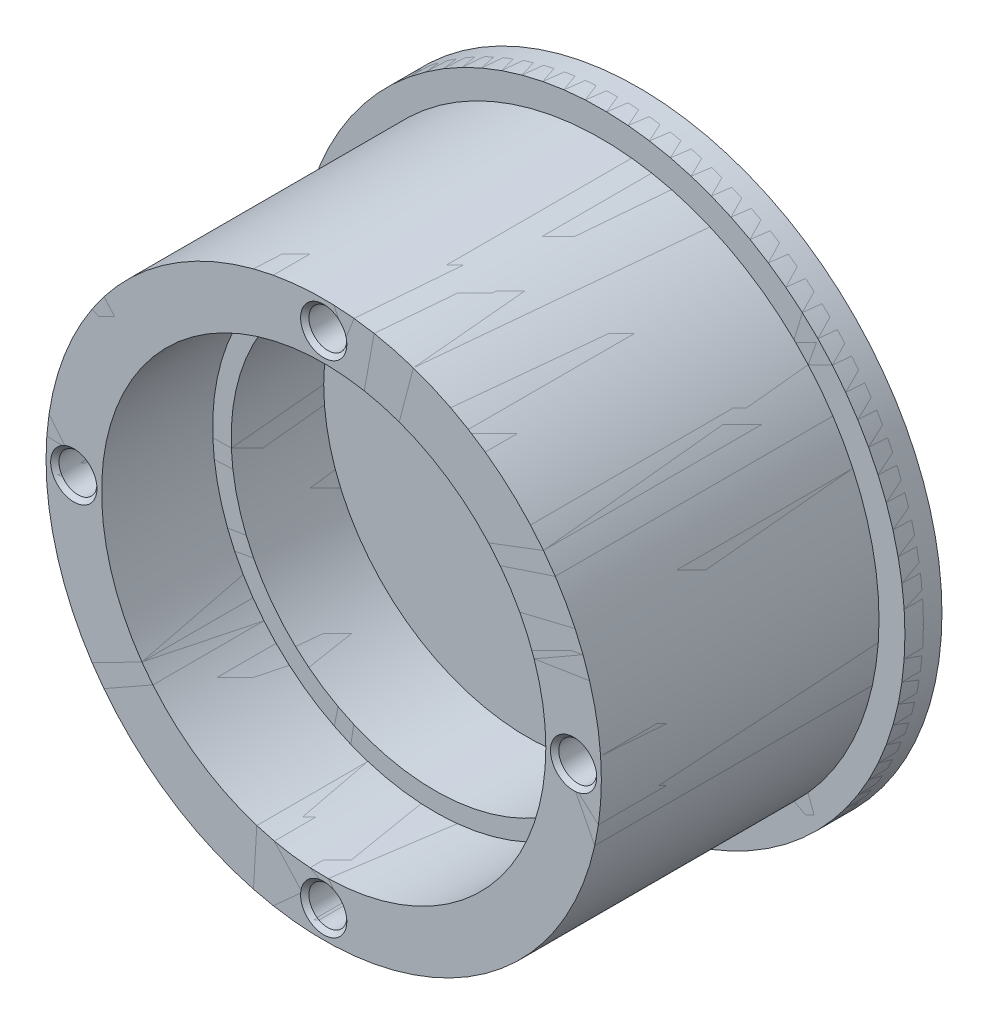
ISO-10303-21;
HEADER;
FILE_DESCRIPTION(('STEP AP214'),'2;1');
FILE_NAME('part.step','',(''),(''),'','','');
FILE_SCHEMA(('AUTOMOTIVE_DESIGN { 1 0 10303 214 1 1 1 1 }'));
ENDSEC;
DATA;
#1=APPLICATION_CONTEXT('core data for automotive mechanical design processes');
#2=APPLICATION_PROTOCOL_DEFINITION('international standard','automotive_design',2000,#1);
#3=PRODUCT_CONTEXT('',#1,'mechanical');
#4=PRODUCT('Part','Part','',(#3));
#5=PRODUCT_RELATED_PRODUCT_CATEGORY('part','',(#4));
#6=PRODUCT_DEFINITION_FORMATION('','',#4);
#7=PRODUCT_DEFINITION_CONTEXT('part definition',#1,'design');
#8=PRODUCT_DEFINITION('design','',#6,#7);
#9=PRODUCT_DEFINITION_SHAPE('','',#8);
#10=(LENGTH_UNIT() NAMED_UNIT(*) SI_UNIT(.MILLI.,.METRE.));
#11=(NAMED_UNIT(*) PLANE_ANGLE_UNIT() SI_UNIT($,.RADIAN.));
#12=(NAMED_UNIT(*) SI_UNIT($,.STERADIAN.) SOLID_ANGLE_UNIT());
#13=UNCERTAINTY_MEASURE_WITH_UNIT(LENGTH_MEASURE(1.E-05),#10,'distance_accuracy_value','');
#14=(GEOMETRIC_REPRESENTATION_CONTEXT(3) GLOBAL_UNCERTAINTY_ASSIGNED_CONTEXT((#13)) GLOBAL_UNIT_ASSIGNED_CONTEXT((#10,
#11,#12)) REPRESENTATION_CONTEXT('',''));
#15=CARTESIAN_POINT('',(0.,0.,0.));
#16=DIRECTION('',(0.,0.,1.));
#17=DIRECTION('',(1.,0.,0.));
#18=AXIS2_PLACEMENT_3D('',#15,#16,#17);
#19=CARTESIAN_POINT('',(0.,0.,-8.5));
#20=DIRECTION('',(0.,0.,1.));
#21=DIRECTION('',(1.,0.,0.));
#22=AXIS2_PLACEMENT_3D('',#19,#20,#21);
#23=CYLINDRICAL_SURFACE('',#22,16.4);
#24=CARTESIAN_POINT('',(0.,0.,-6.5));
#25=DIRECTION('',(0.,0.,-1.));
#26=DIRECTION('',(1.,0.,0.));
#27=AXIS2_PLACEMENT_3D('',#24,#25,#26);
#28=CIRCLE('',#27,16.4);
#29=CARTESIAN_POINT('',(16.4,0.,-6.5));
#30=VERTEX_POINT('',#29);
#31=EDGE_CURVE('P0_E151',#30,#30,#28,.T.);
#32=ORIENTED_EDGE('',*,*,#31,.T.);
#33=EDGE_LOOP('',(#32));
#34=FACE_BOUND('',#33,.T.);
#35=CARTESIAN_POINT('',(0.,0.,-7.5));
#36=DIRECTION('',(0.,0.,-1.));
#37=DIRECTION('',(-1.,0.,0.));
#38=AXIS2_PLACEMENT_3D('',#35,#36,#37);
#39=CIRCLE('',#38,16.4);
#40=CARTESIAN_POINT('',(-16.4,0.,-7.5));
#41=VERTEX_POINT('',#40);
#42=EDGE_CURVE('P0_E181',#41,#41,#39,.T.);
#43=ORIENTED_EDGE('',*,*,#42,.F.);
#44=EDGE_LOOP('',(#43));
#45=FACE_BOUND('',#44,.T.);
#46=ADVANCED_FACE('P0_F47',(#34,#45),#23,.T.);
#47=CARTESIAN_POINT('',(0.,13.5,8.5));
#48=DIRECTION('',(0.,0.,1.));
#49=DIRECTION('',(1.,0.,0.));
#50=AXIS2_PLACEMENT_3D('',#47,#48,#49);
#51=CONICAL_SURFACE('',#50,1.25,0.785398162500002);
#52=CARTESIAN_POINT('',(0.,13.5,8.5));
#53=DIRECTION('',(0.,0.,-1.));
#54=DIRECTION('',(1.,0.,0.));
#55=AXIS2_PLACEMENT_3D('',#52,#53,#54);
#56=CIRCLE('',#55,1.25);
#57=CARTESIAN_POINT('',(1.25000000000005,13.5,8.5));
#58=VERTEX_POINT('',#57);
#59=EDGE_CURVE('P0_E51',#58,#58,#56,.T.);
#60=ORIENTED_EDGE('',*,*,#59,.F.);
#61=EDGE_LOOP('',(#60));
#62=FACE_BOUND('',#61,.T.);
#63=CARTESIAN_POINT('',(0.,13.5,8.275));
#64=DIRECTION('',(0.,0.,1.));
#65=DIRECTION('',(1.,0.,0.));
#66=AXIS2_PLACEMENT_3D('',#63,#64,#65);
#67=CIRCLE('',#66,1.025);
#68=CARTESIAN_POINT('',(1.02500000000005,13.5,8.275));
#69=VERTEX_POINT('',#68);
#70=EDGE_CURVE('P0_E58',#69,#69,#67,.T.);
#71=ORIENTED_EDGE('',*,*,#70,.F.);
#72=EDGE_LOOP('',(#71));
#73=FACE_BOUND('',#72,.T.);
#74=ADVANCED_FACE('P0_F222',(#62,#73),#51,.F.);
#75=CARTESIAN_POINT('',(0.,13.5,8.5));
#76=DIRECTION('',(0.,0.,-1.));
#77=DIRECTION('',(-1.,0.,0.));
#78=AXIS2_PLACEMENT_3D('',#75,#76,#77);
#79=CYLINDRICAL_SURFACE('',#78,1.025);
#80=CARTESIAN_POINT('',(0.,13.5,3.5));
#81=DIRECTION('',(0.,0.,1.));
#82=DIRECTION('',(-1.,0.,0.));
#83=AXIS2_PLACEMENT_3D('',#80,#81,#82);
#84=CIRCLE('',#83,1.025);
#85=CARTESIAN_POINT('',(-1.02499999999995,13.5,3.5));
#86=VERTEX_POINT('',#85);
#87=EDGE_CURVE('P0_E140',#86,#86,#84,.T.);
#88=ORIENTED_EDGE('',*,*,#87,.F.);
#89=EDGE_LOOP('',(#88));
#90=FACE_BOUND('',#89,.T.);
#91=ORIENTED_EDGE('',*,*,#70,.T.);
#92=EDGE_LOOP('',(#91));
#93=FACE_BOUND('',#92,.T.);
#94=ADVANCED_FACE('P0_F227',(#90,#93),#79,.F.);
#95=CARTESIAN_POINT('',(0.,13.5,3.5));
#96=DIRECTION('',(0.,0.,1.));
#97=DIRECTION('',(1.,0.,0.));
#98=AXIS2_PLACEMENT_3D('',#95,#96,#97);
#99=CONICAL_SURFACE('',#98,1.025,1.0297442575);
#100=CARTESIAN_POINT('',(0.,13.5,2.88411786549675));
#101=VERTEX_POINT('',#100);
#102=VERTEX_LOOP('',#101);
#103=FACE_BOUND('',#102,.T.);
#104=ORIENTED_EDGE('',*,*,#87,.T.);
#105=EDGE_LOOP('',(#104));
#106=FACE_BOUND('',#105,.T.);
#107=ADVANCED_FACE('P0_F347',(#103,#106),#99,.F.);
#108=CARTESIAN_POINT('',(13.5,0.,8.5));
#109=DIRECTION('',(0.,0.,1.));
#110=DIRECTION('',(1.,0.,0.));
#111=AXIS2_PLACEMENT_3D('',#108,#109,#110);
#112=CONICAL_SURFACE('',#111,1.25,0.7853981625);
#113=CARTESIAN_POINT('',(13.5,0.,8.5));
#114=DIRECTION('',(0.,0.,-1.));
#115=DIRECTION('',(1.,0.,0.));
#116=AXIS2_PLACEMENT_3D('',#113,#114,#115);
#117=CIRCLE('',#116,1.25);
#118=CARTESIAN_POINT('',(14.75,0.,8.5));
#119=VERTEX_POINT('',#118);
#120=EDGE_CURVE('P0_E190',#119,#119,#117,.T.);
#121=ORIENTED_EDGE('',*,*,#120,.F.);
#122=EDGE_LOOP('',(#121));
#123=FACE_BOUND('',#122,.T.);
#124=CARTESIAN_POINT('',(13.5,0.,8.275));
#125=DIRECTION('',(0.,0.,1.));
#126=DIRECTION('',(1.,0.,0.));
#127=AXIS2_PLACEMENT_3D('',#124,#125,#126);
#128=CIRCLE('',#127,1.025);
#129=CARTESIAN_POINT('',(14.525,0.,8.275));
#130=VERTEX_POINT('',#129);
#131=EDGE_CURVE('P0_E136',#130,#130,#128,.T.);
#132=ORIENTED_EDGE('',*,*,#131,.F.);
#133=EDGE_LOOP('',(#132));
#134=FACE_BOUND('',#133,.T.);
#135=ADVANCED_FACE('P0_F343',(#123,#134),#112,.F.);
#136=CARTESIAN_POINT('',(13.5,0.,8.5));
#137=DIRECTION('',(0.,0.,-1.));
#138=DIRECTION('',(-1.,0.,0.));
#139=AXIS2_PLACEMENT_3D('',#136,#137,#138);
#140=CYLINDRICAL_SURFACE('',#139,1.025);
#141=CARTESIAN_POINT('',(13.5,0.,3.5));
#142=DIRECTION('',(0.,0.,1.));
#143=DIRECTION('',(-1.,0.,0.));
#144=AXIS2_PLACEMENT_3D('',#141,#142,#143);
#145=CIRCLE('',#144,1.025);
#146=CARTESIAN_POINT('',(12.475,0.,3.5));
#147=VERTEX_POINT('',#146);
#148=EDGE_CURVE('P0_E141',#147,#147,#145,.T.);
#149=ORIENTED_EDGE('',*,*,#148,.F.);
#150=EDGE_LOOP('',(#149));
#151=FACE_BOUND('',#150,.T.);
#152=ORIENTED_EDGE('',*,*,#131,.T.);
#153=EDGE_LOOP('',(#152));
#154=FACE_BOUND('',#153,.T.);
#155=ADVANCED_FACE('P0_F137',(#151,#154),#140,.F.);
#156=CARTESIAN_POINT('',(13.5,0.,3.5));
#157=DIRECTION('',(0.,0.,1.));
#158=DIRECTION('',(1.,0.,0.));
#159=AXIS2_PLACEMENT_3D('',#156,#157,#158);
#160=CONICAL_SURFACE('',#159,1.025,1.0297442575);
#161=CARTESIAN_POINT('',(13.5,0.,2.88411786549675));
#162=VERTEX_POINT('',#161);
#163=VERTEX_LOOP('',#162);
#164=FACE_BOUND('',#163,.T.);
#165=ORIENTED_EDGE('',*,*,#148,.T.);
#166=EDGE_LOOP('',(#165));
#167=FACE_BOUND('',#166,.T.);
#168=ADVANCED_FACE('P0_F49',(#164,#167),#160,.F.);
#169=CARTESIAN_POINT('',(0.,-13.5,8.5));
#170=DIRECTION('',(0.,0.,1.));
#171=DIRECTION('',(1.,0.,0.));
#172=AXIS2_PLACEMENT_3D('',#169,#170,#171);
#173=CONICAL_SURFACE('',#172,1.25,0.785398162500002);
#174=CARTESIAN_POINT('',(0.,-13.5,8.5));
#175=DIRECTION('',(0.,0.,-1.));
#176=DIRECTION('',(1.,0.,0.));
#177=AXIS2_PLACEMENT_3D('',#174,#175,#176);
#178=CIRCLE('',#177,1.25);
#179=CARTESIAN_POINT('',(1.24999999999998,-13.5,8.5));
#180=VERTEX_POINT('',#179);
#181=EDGE_CURVE('P0_E169',#180,#180,#178,.T.);
#182=ORIENTED_EDGE('',*,*,#181,.F.);
#183=EDGE_LOOP('',(#182));
#184=FACE_BOUND('',#183,.T.);
#185=CARTESIAN_POINT('',(0.,-13.5,8.275));
#186=DIRECTION('',(0.,0.,1.));
#187=DIRECTION('',(1.,0.,0.));
#188=AXIS2_PLACEMENT_3D('',#185,#186,#187);
#189=CIRCLE('',#188,1.025);
#190=CARTESIAN_POINT('',(1.02499999999998,-13.5,8.275));
#191=VERTEX_POINT('',#190);
#192=EDGE_CURVE('P0_E147',#191,#191,#189,.T.);
#193=ORIENTED_EDGE('',*,*,#192,.F.);
#194=EDGE_LOOP('',(#193));
#195=FACE_BOUND('',#194,.T.);
#196=ADVANCED_FACE('P0_F248',(#184,#195),#173,.F.);
#197=CARTESIAN_POINT('',(0.,-13.5,8.5));
#198=DIRECTION('',(0.,0.,-1.));
#199=DIRECTION('',(-1.,0.,0.));
#200=AXIS2_PLACEMENT_3D('',#197,#198,#199);
#201=CYLINDRICAL_SURFACE('',#200,1.025);
#202=CARTESIAN_POINT('',(0.,-13.5,3.5));
#203=DIRECTION('',(0.,0.,1.));
#204=DIRECTION('',(-1.,0.,0.));
#205=AXIS2_PLACEMENT_3D('',#202,#203,#204);
#206=CIRCLE('',#205,1.025);
#207=CARTESIAN_POINT('',(-1.02500000000002,-13.5,3.5));
#208=VERTEX_POINT('',#207);
#209=EDGE_CURVE('P0_E183',#208,#208,#206,.T.);
#210=ORIENTED_EDGE('',*,*,#209,.F.);
#211=EDGE_LOOP('',(#210));
#212=FACE_BOUND('',#211,.T.);
#213=ORIENTED_EDGE('',*,*,#192,.T.);
#214=EDGE_LOOP('',(#213));
#215=FACE_BOUND('',#214,.T.);
#216=ADVANCED_FACE('P0_F250',(#212,#215),#201,.F.);
#217=CARTESIAN_POINT('',(0.,-13.5,3.5));
#218=DIRECTION('',(0.,0.,1.));
#219=DIRECTION('',(1.,0.,0.));
#220=AXIS2_PLACEMENT_3D('',#217,#218,#219);
#221=CONICAL_SURFACE('',#220,1.025,1.0297442575);
#222=CARTESIAN_POINT('',(0.,-13.5,2.88411786549675));
#223=VERTEX_POINT('',#222);
#224=VERTEX_LOOP('',#223);
#225=FACE_BOUND('',#224,.T.);
#226=ORIENTED_EDGE('',*,*,#209,.T.);
#227=EDGE_LOOP('',(#226));
#228=FACE_BOUND('',#227,.T.);
#229=ADVANCED_FACE('P0_F246',(#225,#228),#221,.F.);
#230=CARTESIAN_POINT('',(-13.5,0.,8.5));
#231=DIRECTION('',(0.,0.,1.));
#232=DIRECTION('',(1.,0.,0.));
#233=AXIS2_PLACEMENT_3D('',#230,#231,#232);
#234=CONICAL_SURFACE('',#233,1.25,0.7853981625);
#235=CARTESIAN_POINT('',(-13.5,0.,8.5));
#236=DIRECTION('',(0.,0.,-1.));
#237=DIRECTION('',(1.,0.,0.));
#238=AXIS2_PLACEMENT_3D('',#235,#236,#237);
#239=CIRCLE('',#238,1.25);
#240=CARTESIAN_POINT('',(-12.25,0.,8.5));
#241=VERTEX_POINT('',#240);
#242=EDGE_CURVE('P0_E163',#241,#241,#239,.T.);
#243=ORIENTED_EDGE('',*,*,#242,.F.);
#244=EDGE_LOOP('',(#243));
#245=FACE_BOUND('',#244,.T.);
#246=CARTESIAN_POINT('',(-13.5,0.,8.275));
#247=DIRECTION('',(0.,0.,1.));
#248=DIRECTION('',(1.,0.,0.));
#249=AXIS2_PLACEMENT_3D('',#246,#247,#248);
#250=CIRCLE('',#249,1.025);
#251=CARTESIAN_POINT('',(-12.475,0.,8.275));
#252=VERTEX_POINT('',#251);
#253=EDGE_CURVE('P0_E186',#252,#252,#250,.T.);
#254=ORIENTED_EDGE('',*,*,#253,.F.);
#255=EDGE_LOOP('',(#254));
#256=FACE_BOUND('',#255,.T.);
#257=ADVANCED_FACE('P0_F243',(#245,#256),#234,.F.);
#258=CARTESIAN_POINT('',(-13.5,0.,8.5));
#259=DIRECTION('',(0.,0.,-1.));
#260=DIRECTION('',(-1.,0.,0.));
#261=AXIS2_PLACEMENT_3D('',#258,#259,#260);
#262=CYLINDRICAL_SURFACE('',#261,1.025);
#263=CARTESIAN_POINT('',(-13.5,0.,3.5));
#264=DIRECTION('',(0.,0.,1.));
#265=DIRECTION('',(-1.,0.,0.));
#266=AXIS2_PLACEMENT_3D('',#263,#264,#265);
#267=CIRCLE('',#266,1.025);
#268=CARTESIAN_POINT('',(-14.525,0.,3.5));
#269=VERTEX_POINT('',#268);
#270=EDGE_CURVE('P0_E161',#269,#269,#267,.T.);
#271=ORIENTED_EDGE('',*,*,#270,.F.);
#272=EDGE_LOOP('',(#271));
#273=FACE_BOUND('',#272,.T.);
#274=ORIENTED_EDGE('',*,*,#253,.T.);
#275=EDGE_LOOP('',(#274));
#276=FACE_BOUND('',#275,.T.);
#277=ADVANCED_FACE('P0_F240',(#273,#276),#262,.F.);
#278=CARTESIAN_POINT('',(-13.5,0.,3.5));
#279=DIRECTION('',(0.,0.,1.));
#280=DIRECTION('',(1.,0.,0.));
#281=AXIS2_PLACEMENT_3D('',#278,#279,#280);
#282=CONICAL_SURFACE('',#281,1.025,1.0297442575);
#283=CARTESIAN_POINT('',(-13.5,0.,2.88411786549675));
#284=VERTEX_POINT('',#283);
#285=VERTEX_LOOP('',#284);
#286=FACE_BOUND('',#285,.T.);
#287=ORIENTED_EDGE('',*,*,#270,.T.);
#288=EDGE_LOOP('',(#287));
#289=FACE_BOUND('',#288,.T.);
#290=ADVANCED_FACE('P0_F233',(#286,#289),#282,.F.);
#291=CARTESIAN_POINT('',(0.,0.,2.5));
#292=DIRECTION('',(0.,0.,1.));
#293=DIRECTION('',(1.,0.,0.));
#294=AXIS2_PLACEMENT_3D('',#291,#292,#293);
#295=CYLINDRICAL_SURFACE('',#294,12.);
#296=CARTESIAN_POINT('',(0.,0.,8.5));
#297=DIRECTION('',(0.,0.,1.));
#298=DIRECTION('',(1.,0.,0.));
#299=AXIS2_PLACEMENT_3D('',#296,#297,#298);
#300=CIRCLE('',#299,12.);
#301=CARTESIAN_POINT('',(12.,0.,8.5));
#302=VERTEX_POINT('',#301);
#303=EDGE_CURVE('P0_E155',#302,#302,#300,.T.);
#304=ORIENTED_EDGE('',*,*,#303,.T.);
#305=EDGE_LOOP('',(#304));
#306=FACE_BOUND('',#305,.T.);
#307=CARTESIAN_POINT('',(0.,0.,2.5));
#308=DIRECTION('',(0.,0.,-1.));
#309=DIRECTION('',(1.,0.,0.));
#310=AXIS2_PLACEMENT_3D('',#307,#308,#309);
#311=CIRCLE('',#310,12.);
#312=CARTESIAN_POINT('',(12.,0.,2.5));
#313=VERTEX_POINT('',#312);
#314=EDGE_CURVE('P0_E154',#313,#313,#311,.T.);
#315=ORIENTED_EDGE('',*,*,#314,.T.);
#316=EDGE_LOOP('',(#315));
#317=FACE_BOUND('',#316,.T.);
#318=ADVANCED_FACE('P0_F216',(#306,#317),#295,.F.);
#319=CARTESIAN_POINT('',(0.,0.,2.5));
#320=DIRECTION('',(0.,0.,1.));
#321=DIRECTION('',(1.,0.,0.));
#322=AXIS2_PLACEMENT_3D('',#319,#320,#321);
#323=PLANE('',#322);
#324=CARTESIAN_POINT('',(0.,0.,2.5));
#325=DIRECTION('',(0.,0.,-1.));
#326=DIRECTION('',(1.,0.,0.));
#327=AXIS2_PLACEMENT_3D('',#324,#325,#326);
#328=CIRCLE('',#327,11.);
#329=CARTESIAN_POINT('',(11.,0.,2.5));
#330=VERTEX_POINT('',#329);
#331=EDGE_CURVE('P0_E179',#330,#330,#328,.T.);
#332=ORIENTED_EDGE('',*,*,#331,.T.);
#333=EDGE_LOOP('',(#332));
#334=FACE_BOUND('',#333,.T.);
#335=ORIENTED_EDGE('',*,*,#314,.F.);
#336=EDGE_LOOP('',(#335));
#337=FACE_BOUND('',#336,.T.);
#338=ADVANCED_FACE('P0_F208',(#334,#337),#323,.T.);
#339=CARTESIAN_POINT('',(0.,0.,-6.5));
#340=DIRECTION('',(0.,0.,-1.));
#341=DIRECTION('',(0.,-1.,0.));
#342=AXIS2_PLACEMENT_3D('',#339,#340,#341);
#343=PLANE('',#342);
#344=ORIENTED_EDGE('',*,*,#31,.F.);
#345=EDGE_LOOP('',(#344));
#346=FACE_BOUND('',#345,.T.);
#347=CARTESIAN_POINT('',(0.,0.,-6.5));
#348=DIRECTION('',(0.,0.,1.));
#349=DIRECTION('',(1.,0.,0.));
#350=AXIS2_PLACEMENT_3D('',#347,#348,#349);
#351=CIRCLE('',#350,15.);
#352=CARTESIAN_POINT('',(15.,0.,-6.5));
#353=VERTEX_POINT('',#352);
#354=EDGE_CURVE('P0_E172',#353,#353,#351,.T.);
#355=ORIENTED_EDGE('',*,*,#354,.F.);
#356=EDGE_LOOP('',(#355));
#357=FACE_BOUND('',#356,.T.);
#358=ADVANCED_FACE('P0_F205',(#346,#357),#343,.F.);
#359=CARTESIAN_POINT('',(0.,0.,8.5));
#360=DIRECTION('',(0.,0.,1.));
#361=DIRECTION('',(1.,0.,0.));
#362=AXIS2_PLACEMENT_3D('',#359,#360,#361);
#363=PLANE('',#362);
#364=CARTESIAN_POINT('',(0.,0.,8.5));
#365=DIRECTION('',(0.,0.,1.));
#366=DIRECTION('',(1.,0.,0.));
#367=AXIS2_PLACEMENT_3D('',#364,#365,#366);
#368=CIRCLE('',#367,15.);
#369=CARTESIAN_POINT('',(15.,0.,8.5));
#370=VERTEX_POINT('',#369);
#371=EDGE_CURVE('P0_E191',#370,#370,#368,.T.);
#372=ORIENTED_EDGE('',*,*,#371,.T.);
#373=EDGE_LOOP('',(#372));
#374=FACE_BOUND('',#373,.T.);
#375=ORIENTED_EDGE('',*,*,#303,.F.);
#376=EDGE_LOOP('',(#375));
#377=FACE_BOUND('',#376,.T.);
#378=ORIENTED_EDGE('',*,*,#242,.T.);
#379=EDGE_LOOP('',(#378));
#380=FACE_BOUND('',#379,.T.);
#381=ORIENTED_EDGE('',*,*,#181,.T.);
#382=EDGE_LOOP('',(#381));
#383=FACE_BOUND('',#382,.T.);
#384=ORIENTED_EDGE('',*,*,#120,.T.);
#385=EDGE_LOOP('',(#384));
#386=FACE_BOUND('',#385,.T.);
#387=ORIENTED_EDGE('',*,*,#59,.T.);
#388=EDGE_LOOP('',(#387));
#389=FACE_BOUND('',#388,.T.);
#390=ADVANCED_FACE('P0_F207',(#374,#377,#380,#383,#386,#389),#363,.T.);
#391=CARTESIAN_POINT('',(0.,0.,-6.5));
#392=DIRECTION('',(0.,0.,1.));
#393=DIRECTION('',(1.,0.,0.));
#394=AXIS2_PLACEMENT_3D('',#391,#392,#393);
#395=CYLINDRICAL_SURFACE('',#394,15.);
#396=ORIENTED_EDGE('',*,*,#371,.F.);
#397=EDGE_LOOP('',(#396));
#398=FACE_BOUND('',#397,.T.);
#399=ORIENTED_EDGE('',*,*,#354,.T.);
#400=EDGE_LOOP('',(#399));
#401=FACE_BOUND('',#400,.T.);
#402=ADVANCED_FACE('P0_F203',(#398,#401),#395,.T.);
#403=CARTESIAN_POINT('',(0.,0.,-6.5));
#404=DIRECTION('',(0.,0.,1.));
#405=DIRECTION('',(1.,0.,0.));
#406=AXIS2_PLACEMENT_3D('',#403,#404,#405);
#407=CYLINDRICAL_SURFACE('',#406,11.);
#408=CARTESIAN_POINT('',(0.,0.,-2.5));
#409=DIRECTION('',(0.,0.,1.));
#410=DIRECTION('',(-1.,0.,0.));
#411=AXIS2_PLACEMENT_3D('',#408,#409,#410);
#412=CIRCLE('',#411,11.);
#413=CARTESIAN_POINT('',(-11.,0.,-2.5));
#414=VERTEX_POINT('',#413);
#415=EDGE_CURVE('P0_E175',#414,#414,#412,.T.);
#416=ORIENTED_EDGE('',*,*,#415,.F.);
#417=EDGE_LOOP('',(#416));
#418=FACE_BOUND('',#417,.T.);
#419=ORIENTED_EDGE('',*,*,#331,.F.);
#420=EDGE_LOOP('',(#419));
#421=FACE_BOUND('',#420,.T.);
#422=ADVANCED_FACE('P0_F235',(#418,#421),#407,.F.);
#423=CARTESIAN_POINT('',(0.,0.,-7.5));
#424=DIRECTION('',(0.,0.,-1.));
#425=DIRECTION('',(-1.,0.,0.));
#426=AXIS2_PLACEMENT_3D('',#423,#424,#425);
#427=PLANE('',#426);
#428=CARTESIAN_POINT('',(0.,0.,-7.5));
#429=DIRECTION('',(0.,0.,-1.));
#430=DIRECTION('',(-1.,0.,0.));
#431=AXIS2_PLACEMENT_3D('',#428,#429,#430);
#432=CIRCLE('',#431,6.05);
#433=CARTESIAN_POINT('',(-6.05,0.,-7.5));
#434=VERTEX_POINT('',#433);
#435=EDGE_CURVE('P0_E11',#434,#434,#432,.T.);
#436=ORIENTED_EDGE('',*,*,#435,.F.);
#437=EDGE_LOOP('',(#436));
#438=FACE_BOUND('',#437,.T.);
#439=ORIENTED_EDGE('',*,*,#42,.T.);
#440=EDGE_LOOP('',(#439));
#441=FACE_BOUND('',#440,.T.);
#442=ADVANCED_FACE('P0_F237',(#438,#441),#427,.T.);
#443=CARTESIAN_POINT('',(0.,0.,-2.5));
#444=DIRECTION('',(0.,0.,-1.));
#445=DIRECTION('',(-1.,0.,0.));
#446=AXIS2_PLACEMENT_3D('',#443,#444,#445);
#447=PLANE('',#446);
#448=ORIENTED_EDGE('',*,*,#415,.T.);
#449=EDGE_LOOP('',(#448));
#450=FACE_BOUND('',#449,.T.);
#451=ADVANCED_FACE('P0_F445',(#450),#447,.F.);
#452=CARTESIAN_POINT('',(0.,0.,-13.));
#453=DIRECTION('',(0.,0.,1.));
#454=DIRECTION('',(1.,0.,0.));
#455=AXIS2_PLACEMENT_3D('',#452,#453,#454);
#456=CYLINDRICAL_SURFACE('',#455,6.05);
#457=CARTESIAN_POINT('',(0.,0.,-13.));
#458=DIRECTION('',(0.,0.,-1.));
#459=DIRECTION('',(-1.,0.,0.));
#460=AXIS2_PLACEMENT_3D('',#457,#458,#459);
#461=CIRCLE('',#460,6.05);
#462=CARTESIAN_POINT('',(-6.05,0.,-13.));
#463=VERTEX_POINT('',#462);
#464=EDGE_CURVE('P0_E483',#463,#463,#461,.T.);
#465=ORIENTED_EDGE('',*,*,#464,.F.);
#466=EDGE_LOOP('',(#465));
#467=FACE_BOUND('',#466,.T.);
#468=ORIENTED_EDGE('',*,*,#435,.T.);
#469=EDGE_LOOP('',(#468));
#470=FACE_BOUND('',#469,.T.);
#471=ADVANCED_FACE('P0_F450',(#467,#470),#456,.T.);
#472=CARTESIAN_POINT('',(0.,0.,-13.));
#473=DIRECTION('',(0.,0.,-1.));
#474=DIRECTION('',(-1.,0.,0.));
#475=AXIS2_PLACEMENT_3D('',#472,#473,#474);
#476=PLANE('',#475);
#477=ORIENTED_EDGE('',*,*,#464,.T.);
#478=EDGE_LOOP('',(#477));
#479=FACE_BOUND('',#478,.T.);
#480=ADVANCED_FACE('P0_F467',(#479),#476,.T.);
#481=CLOSED_SHELL('',(#46,#74,#94,#107,#135,#155,#168,#196,#216,#229,#257,#277,#290,#318,#338,
#358,#390,#402,#422,#442,#451,#471,#480));
#482=MANIFOLD_SOLID_BREP('P0_B2',#481);
#483=CARTESIAN_POINT('',(0.,13.5,8.5));
#484=DIRECTION('',(0.,0.,1.));
#485=DIRECTION('',(1.,0.,0.));
#486=AXIS2_PLACEMENT_3D('',#483,#484,#485);
#487=CONICAL_SURFACE('',#486,1.25,0.785398162500002);
#488=CARTESIAN_POINT('',(0.,13.5,8.5));
#489=DIRECTION('',(0.,0.,-1.));
#490=DIRECTION('',(1.,0.,0.));
#491=AXIS2_PLACEMENT_3D('',#488,#489,#490);
#492=CIRCLE('',#491,1.25);
#493=CARTESIAN_POINT('',(1.25000000000005,13.5,8.5));
#494=VERTEX_POINT('',#493);
#495=EDGE_CURVE('P1_E21',#494,#494,#492,.T.);
#496=ORIENTED_EDGE('',*,*,#495,.F.);
#497=EDGE_LOOP('',(#496));
#498=FACE_BOUND('',#497,.T.);
#499=CARTESIAN_POINT('',(0.,13.5,8.275));
#500=DIRECTION('',(0.,0.,1.));
#501=DIRECTION('',(1.,0.,0.));
#502=AXIS2_PLACEMENT_3D('',#499,#500,#501);
#503=CIRCLE('',#502,1.025);
#504=CARTESIAN_POINT('',(1.02500000000005,13.5,8.275));
#505=VERTEX_POINT('',#504);
#506=EDGE_CURVE('P1_E11',#505,#505,#503,.T.);
#507=ORIENTED_EDGE('',*,*,#506,.F.);
#508=EDGE_LOOP('',(#507));
#509=FACE_BOUND('',#508,.T.);
#510=ADVANCED_FACE('P1_F17',(#498,#509),#487,.F.);
#511=CARTESIAN_POINT('',(0.,13.5,8.5));
#512=DIRECTION('',(0.,0.,-1.));
#513=DIRECTION('',(-1.,0.,0.));
#514=AXIS2_PLACEMENT_3D('',#511,#512,#513);
#515=CYLINDRICAL_SURFACE('',#514,1.025);
#516=CARTESIAN_POINT('',(0.,13.5,3.5));
#517=DIRECTION('',(0.,0.,1.));
#518=DIRECTION('',(-1.,0.,0.));
#519=AXIS2_PLACEMENT_3D('',#516,#517,#518);
#520=CIRCLE('',#519,1.025);
#521=CARTESIAN_POINT('',(-1.02499999999995,13.5,3.5));
#522=VERTEX_POINT('',#521);
#523=EDGE_CURVE('P1_E28',#522,#522,#520,.T.);
#524=ORIENTED_EDGE('',*,*,#523,.F.);
#525=EDGE_LOOP('',(#524));
#526=FACE_BOUND('',#525,.T.);
#527=ORIENTED_EDGE('',*,*,#506,.T.);
#528=EDGE_LOOP('',(#527));
#529=FACE_BOUND('',#528,.T.);
#530=ADVANCED_FACE('P1_F213',(#526,#529),#515,.F.);
#531=CARTESIAN_POINT('',(0.,13.5,3.5));
#532=DIRECTION('',(0.,0.,1.));
#533=DIRECTION('',(1.,0.,0.));
#534=AXIS2_PLACEMENT_3D('',#531,#532,#533);
#535=CONICAL_SURFACE('',#534,1.025,1.0297442575);
#536=CARTESIAN_POINT('',(0.,13.5,2.88411786549675));
#537=VERTEX_POINT('',#536);
#538=VERTEX_LOOP('',#537);
#539=FACE_BOUND('',#538,.T.);
#540=ORIENTED_EDGE('',*,*,#523,.T.);
#541=EDGE_LOOP('',(#540));
#542=FACE_BOUND('',#541,.T.);
#543=ADVANCED_FACE('P1_F219',(#539,#542),#535,.F.);
#544=CARTESIAN_POINT('',(13.5,0.,8.5));
#545=DIRECTION('',(0.,0.,1.));
#546=DIRECTION('',(1.,0.,0.));
#547=AXIS2_PLACEMENT_3D('',#544,#545,#546);
#548=CONICAL_SURFACE('',#547,1.25,0.7853981625);
#549=CARTESIAN_POINT('',(13.5,0.,8.5));
#550=DIRECTION('',(0.,0.,-1.));
#551=DIRECTION('',(1.,0.,0.));
#552=AXIS2_PLACEMENT_3D('',#549,#550,#551);
#553=CIRCLE('',#552,1.25);
#554=CARTESIAN_POINT('',(14.75,0.,8.5));
#555=VERTEX_POINT('',#554);
#556=EDGE_CURVE('P1_E168',#555,#555,#553,.T.);
#557=ORIENTED_EDGE('',*,*,#556,.F.);
#558=EDGE_LOOP('',(#557));
#559=FACE_BOUND('',#558,.T.);
#560=CARTESIAN_POINT('',(13.5,0.,8.275));
#561=DIRECTION('',(0.,0.,1.));
#562=DIRECTION('',(1.,0.,0.));
#563=AXIS2_PLACEMENT_3D('',#560,#561,#562);
#564=CIRCLE('',#563,1.025);
#565=CARTESIAN_POINT('',(14.525,0.,8.275));
#566=VERTEX_POINT('',#565);
#567=EDGE_CURVE('P1_E122',#566,#566,#564,.T.);
#568=ORIENTED_EDGE('',*,*,#567,.F.);
#569=EDGE_LOOP('',(#568));
#570=FACE_BOUND('',#569,.T.);
#571=ADVANCED_FACE('P1_F224',(#559,#570),#548,.F.);
#572=CARTESIAN_POINT('',(13.5,0.,8.5));
#573=DIRECTION('',(0.,0.,-1.));
#574=DIRECTION('',(-1.,0.,0.));
#575=AXIS2_PLACEMENT_3D('',#572,#573,#574);
#576=CYLINDRICAL_SURFACE('',#575,1.025);
#577=CARTESIAN_POINT('',(13.5,0.,3.5));
#578=DIRECTION('',(0.,0.,1.));
#579=DIRECTION('',(-1.,0.,0.));
#580=AXIS2_PLACEMENT_3D('',#577,#578,#579);
#581=CIRCLE('',#580,1.025);
#582=CARTESIAN_POINT('',(12.475,0.,3.5));
#583=VERTEX_POINT('',#582);
#584=EDGE_CURVE('P1_E126',#583,#583,#581,.T.);
#585=ORIENTED_EDGE('',*,*,#584,.F.);
#586=EDGE_LOOP('',(#585));
#587=FACE_BOUND('',#586,.T.);
#588=ORIENTED_EDGE('',*,*,#567,.T.);
#589=EDGE_LOOP('',(#588));
#590=FACE_BOUND('',#589,.T.);
#591=ADVANCED_FACE('P1_F123',(#587,#590),#576,.F.);
#592=CARTESIAN_POINT('',(13.5,0.,3.5));
#593=DIRECTION('',(0.,0.,1.));
#594=DIRECTION('',(1.,0.,0.));
#595=AXIS2_PLACEMENT_3D('',#592,#593,#594);
#596=CONICAL_SURFACE('',#595,1.025,1.0297442575);
#597=CARTESIAN_POINT('',(13.5,0.,2.88411786549675));
#598=VERTEX_POINT('',#597);
#599=VERTEX_LOOP('',#598);
#600=FACE_BOUND('',#599,.T.);
#601=ORIENTED_EDGE('',*,*,#584,.T.);
#602=EDGE_LOOP('',(#601));
#603=FACE_BOUND('',#602,.T.);
#604=ADVANCED_FACE('P1_F19',(#600,#603),#596,.F.);
#605=CARTESIAN_POINT('',(0.,-13.5,8.5));
#606=DIRECTION('',(0.,0.,1.));
#607=DIRECTION('',(1.,0.,0.));
#608=AXIS2_PLACEMENT_3D('',#605,#606,#607);
#609=CONICAL_SURFACE('',#608,1.25,0.785398162500002);
#610=CARTESIAN_POINT('',(0.,-13.5,8.5));
#611=DIRECTION('',(0.,0.,-1.));
#612=DIRECTION('',(1.,0.,0.));
#613=AXIS2_PLACEMENT_3D('',#610,#611,#612);
#614=CIRCLE('',#613,1.25);
#615=CARTESIAN_POINT('',(1.24999999999998,-13.5,8.5));
#616=VERTEX_POINT('',#615);
#617=EDGE_CURVE('P1_E166',#616,#616,#614,.T.);
#618=ORIENTED_EDGE('',*,*,#617,.F.);
#619=EDGE_LOOP('',(#618));
#620=FACE_BOUND('',#619,.T.);
#621=CARTESIAN_POINT('',(0.,-13.5,8.275));
#622=DIRECTION('',(0.,0.,1.));
#623=DIRECTION('',(1.,0.,0.));
#624=AXIS2_PLACEMENT_3D('',#621,#622,#623);
#625=CIRCLE('',#624,1.025);
#626=CARTESIAN_POINT('',(1.02499999999998,-13.5,8.275));
#627=VERTEX_POINT('',#626);
#628=EDGE_CURVE('P1_E134',#627,#627,#625,.T.);
#629=ORIENTED_EDGE('',*,*,#628,.F.);
#630=EDGE_LOOP('',(#629));
#631=FACE_BOUND('',#630,.T.);
#632=ADVANCED_FACE('P1_F242',(#620,#631),#609,.F.);
#633=CARTESIAN_POINT('',(0.,-13.5,8.5));
#634=DIRECTION('',(0.,0.,-1.));
#635=DIRECTION('',(-1.,0.,0.));
#636=AXIS2_PLACEMENT_3D('',#633,#634,#635);
#637=CYLINDRICAL_SURFACE('',#636,1.025);
#638=CARTESIAN_POINT('',(0.,-13.5,3.5));
#639=DIRECTION('',(0.,0.,1.));
#640=DIRECTION('',(-1.,0.,0.));
#641=AXIS2_PLACEMENT_3D('',#638,#639,#640);
#642=CIRCLE('',#641,1.025);
#643=CARTESIAN_POINT('',(-1.02500000000002,-13.5,3.5));
#644=VERTEX_POINT('',#643);
#645=EDGE_CURVE('P1_E162',#644,#644,#642,.T.);
#646=ORIENTED_EDGE('',*,*,#645,.F.);
#647=EDGE_LOOP('',(#646));
#648=FACE_BOUND('',#647,.T.);
#649=ORIENTED_EDGE('',*,*,#628,.T.);
#650=EDGE_LOOP('',(#649));
#651=FACE_BOUND('',#650,.T.);
#652=ADVANCED_FACE('P1_F238',(#648,#651),#637,.F.);
#653=CARTESIAN_POINT('',(0.,-13.5,3.5));
#654=DIRECTION('',(0.,0.,1.));
#655=DIRECTION('',(1.,0.,0.));
#656=AXIS2_PLACEMENT_3D('',#653,#654,#655);
#657=CONICAL_SURFACE('',#656,1.025,1.0297442575);
#658=CARTESIAN_POINT('',(0.,-13.5,2.88411786549675));
#659=VERTEX_POINT('',#658);
#660=VERTEX_LOOP('',#659);
#661=FACE_BOUND('',#660,.T.);
#662=ORIENTED_EDGE('',*,*,#645,.T.);
#663=EDGE_LOOP('',(#662));
#664=FACE_BOUND('',#663,.T.);
#665=ADVANCED_FACE('P1_F241',(#661,#664),#657,.F.);
#666=CARTESIAN_POINT('',(-13.5,0.,8.5));
#667=DIRECTION('',(0.,0.,1.));
#668=DIRECTION('',(1.,0.,0.));
#669=AXIS2_PLACEMENT_3D('',#666,#667,#668);
#670=CONICAL_SURFACE('',#669,1.25,0.7853981625);
#671=CARTESIAN_POINT('',(-13.5,0.,8.5));
#672=DIRECTION('',(0.,0.,-1.));
#673=DIRECTION('',(1.,0.,0.));
#674=AXIS2_PLACEMENT_3D('',#671,#672,#673);
#675=CIRCLE('',#674,1.25);
#676=CARTESIAN_POINT('',(-12.25,0.,8.5));
#677=VERTEX_POINT('',#676);
#678=EDGE_CURVE('P1_E158',#677,#677,#675,.T.);
#679=ORIENTED_EDGE('',*,*,#678,.F.);
#680=EDGE_LOOP('',(#679));
#681=FACE_BOUND('',#680,.T.);
#682=CARTESIAN_POINT('',(-13.5,0.,8.275));
#683=DIRECTION('',(0.,0.,1.));
#684=DIRECTION('',(1.,0.,0.));
#685=AXIS2_PLACEMENT_3D('',#682,#683,#684);
#686=CIRCLE('',#685,1.025);
#687=CARTESIAN_POINT('',(-12.475,0.,8.275));
#688=VERTEX_POINT('',#687);
#689=EDGE_CURVE('P1_E163',#688,#688,#686,.T.);
#690=ORIENTED_EDGE('',*,*,#689,.F.);
#691=EDGE_LOOP('',(#690));
#692=FACE_BOUND('',#691,.T.);
#693=ADVANCED_FACE('P1_F323',(#681,#692),#670,.F.);
#694=CARTESIAN_POINT('',(-13.5,0.,8.5));
#695=DIRECTION('',(0.,0.,-1.));
#696=DIRECTION('',(-1.,0.,0.));
#697=AXIS2_PLACEMENT_3D('',#694,#695,#696);
#698=CYLINDRICAL_SURFACE('',#697,1.025);
#699=CARTESIAN_POINT('',(-13.5,0.,3.5));
#700=DIRECTION('',(0.,0.,1.));
#701=DIRECTION('',(-1.,0.,0.));
#702=AXIS2_PLACEMENT_3D('',#699,#700,#701);
#703=CIRCLE('',#702,1.025);
#704=CARTESIAN_POINT('',(-14.525,0.,3.5));
#705=VERTEX_POINT('',#704);
#706=EDGE_CURVE('P1_E165',#705,#705,#703,.T.);
#707=ORIENTED_EDGE('',*,*,#706,.F.);
#708=EDGE_LOOP('',(#707));
#709=FACE_BOUND('',#708,.T.);
#710=ORIENTED_EDGE('',*,*,#689,.T.);
#711=EDGE_LOOP('',(#710));
#712=FACE_BOUND('',#711,.T.);
#713=ADVANCED_FACE('P1_F331',(#709,#712),#698,.F.);
#714=CARTESIAN_POINT('',(-13.5,0.,3.5));
#715=DIRECTION('',(0.,0.,1.));
#716=DIRECTION('',(1.,0.,0.));
#717=AXIS2_PLACEMENT_3D('',#714,#715,#716);
#718=CONICAL_SURFACE('',#717,1.025,1.0297442575);
#719=CARTESIAN_POINT('',(-13.5,0.,2.88411786549675));
#720=VERTEX_POINT('',#719);
#721=VERTEX_LOOP('',#720);
#722=FACE_BOUND('',#721,.T.);
#723=ORIENTED_EDGE('',*,*,#706,.T.);
#724=EDGE_LOOP('',(#723));
#725=FACE_BOUND('',#724,.T.);
#726=ADVANCED_FACE('P1_F263',(#722,#725),#718,.F.);
#727=CARTESIAN_POINT('',(0.,0.,-2.5));
#728=DIRECTION('',(0.,0.,-1.));
#729=DIRECTION('',(-1.,0.,0.));
#730=AXIS2_PLACEMENT_3D('',#727,#728,#729);
#731=CYLINDRICAL_SURFACE('',#730,12.);
#732=CARTESIAN_POINT('',(0.,0.,-8.5));
#733=DIRECTION('',(0.,0.,-1.));
#734=DIRECTION('',(1.,0.,0.));
#735=AXIS2_PLACEMENT_3D('',#732,#733,#734);
#736=CIRCLE('',#735,12.);
#737=CARTESIAN_POINT('',(12.,0.,-8.5));
#738=VERTEX_POINT('',#737);
#739=EDGE_CURVE('P1_E140',#738,#738,#736,.T.);
#740=ORIENTED_EDGE('',*,*,#739,.T.);
#741=EDGE_LOOP('',(#740));
#742=FACE_BOUND('',#741,.T.);
#743=CARTESIAN_POINT('',(0.,0.,-2.5));
#744=DIRECTION('',(0.,0.,1.));
#745=DIRECTION('',(1.,0.,0.));
#746=AXIS2_PLACEMENT_3D('',#743,#744,#745);
#747=CIRCLE('',#746,12.);
#748=CARTESIAN_POINT('',(12.,0.,-2.5));
#749=VERTEX_POINT('',#748);
#750=EDGE_CURVE('P1_E266',#749,#749,#747,.T.);
#751=ORIENTED_EDGE('',*,*,#750,.T.);
#752=EDGE_LOOP('',(#751));
#753=FACE_BOUND('',#752,.T.);
#754=ADVANCED_FACE('P1_F260',(#742,#753),#731,.F.);
#755=CARTESIAN_POINT('',(0.,0.,-2.5));
#756=DIRECTION('',(0.,0.,-1.));
#757=DIRECTION('',(0.,-1.,0.));
#758=AXIS2_PLACEMENT_3D('',#755,#756,#757);
#759=PLANE('',#758);
#760=CARTESIAN_POINT('',(0.,0.,-2.5));
#761=DIRECTION('',(0.,0.,1.));
#762=DIRECTION('',(-1.,0.,0.));
#763=AXIS2_PLACEMENT_3D('',#760,#761,#762);
#764=CIRCLE('',#763,11.);
#765=CARTESIAN_POINT('',(-11.,0.,-2.5));
#766=VERTEX_POINT('',#765);
#767=EDGE_CURVE('P1_E178',#766,#766,#764,.T.);
#768=ORIENTED_EDGE('',*,*,#767,.T.);
#769=EDGE_LOOP('',(#768));
#770=FACE_BOUND('',#769,.T.);
#771=ORIENTED_EDGE('',*,*,#750,.F.);
#772=EDGE_LOOP('',(#771));
#773=FACE_BOUND('',#772,.T.);
#774=ADVANCED_FACE('P1_F233',(#770,#773),#759,.T.);
#775=CARTESIAN_POINT('',(0.,0.,2.5));
#776=DIRECTION('',(0.,0.,1.));
#777=DIRECTION('',(1.,0.,0.));
#778=AXIS2_PLACEMENT_3D('',#775,#776,#777);
#779=CYLINDRICAL_SURFACE('',#778,12.);
#780=CARTESIAN_POINT('',(0.,0.,8.5));
#781=DIRECTION('',(0.,0.,1.));
#782=DIRECTION('',(1.,0.,0.));
#783=AXIS2_PLACEMENT_3D('',#780,#781,#782);
#784=CIRCLE('',#783,12.);
#785=CARTESIAN_POINT('',(12.,0.,8.5));
#786=VERTEX_POINT('',#785);
#787=EDGE_CURVE('P1_E150',#786,#786,#784,.T.);
#788=ORIENTED_EDGE('',*,*,#787,.T.);
#789=EDGE_LOOP('',(#788));
#790=FACE_BOUND('',#789,.T.);
#791=CARTESIAN_POINT('',(0.,0.,2.5));
#792=DIRECTION('',(0.,0.,-1.));
#793=DIRECTION('',(1.,0.,0.));
#794=AXIS2_PLACEMENT_3D('',#791,#792,#793);
#795=CIRCLE('',#794,12.);
#796=CARTESIAN_POINT('',(12.,0.,2.5));
#797=VERTEX_POINT('',#796);
#798=EDGE_CURVE('P1_E147',#797,#797,#795,.T.);
#799=ORIENTED_EDGE('',*,*,#798,.T.);
#800=EDGE_LOOP('',(#799));
#801=FACE_BOUND('',#800,.T.);
#802=ADVANCED_FACE('P1_F230',(#790,#801),#779,.F.);
#803=CARTESIAN_POINT('',(0.,0.,2.5));
#804=DIRECTION('',(0.,0.,1.));
#805=DIRECTION('',(1.,0.,0.));
#806=AXIS2_PLACEMENT_3D('',#803,#804,#805);
#807=PLANE('',#806);
#808=CARTESIAN_POINT('',(0.,0.,2.5));
#809=DIRECTION('',(0.,0.,-1.));
#810=DIRECTION('',(1.,0.,0.));
#811=AXIS2_PLACEMENT_3D('',#808,#809,#810);
#812=CIRCLE('',#811,11.);
#813=CARTESIAN_POINT('',(11.,0.,2.5));
#814=VERTEX_POINT('',#813);
#815=EDGE_CURVE('P1_E184',#814,#814,#812,.T.);
#816=ORIENTED_EDGE('',*,*,#815,.T.);
#817=EDGE_LOOP('',(#816));
#818=FACE_BOUND('',#817,.T.);
#819=ORIENTED_EDGE('',*,*,#798,.F.);
#820=EDGE_LOOP('',(#819));
#821=FACE_BOUND('',#820,.T.);
#822=ADVANCED_FACE('P1_F194',(#818,#821),#807,.T.);
#823=CARTESIAN_POINT('',(0.,0.,-6.5));
#824=DIRECTION('',(0.,0.,-1.));
#825=DIRECTION('',(0.,-1.,0.));
#826=AXIS2_PLACEMENT_3D('',#823,#824,#825);
#827=PLANE('',#826);
#828=CARTESIAN_POINT('',(0.,0.,-6.5));
#829=DIRECTION('',(0.,0.,-1.));
#830=DIRECTION('',(1.,0.,0.));
#831=AXIS2_PLACEMENT_3D('',#828,#829,#830);
#832=CIRCLE('',#831,16.4);
#833=CARTESIAN_POINT('',(16.4,0.,-6.5));
#834=VERTEX_POINT('',#833);
#835=EDGE_CURVE('P1_E138',#834,#834,#832,.T.);
#836=ORIENTED_EDGE('',*,*,#835,.F.);
#837=EDGE_LOOP('',(#836));
#838=FACE_BOUND('',#837,.T.);
#839=CARTESIAN_POINT('',(0.,0.,-6.5));
#840=DIRECTION('',(0.,0.,1.));
#841=DIRECTION('',(1.,0.,0.));
#842=AXIS2_PLACEMENT_3D('',#839,#840,#841);
#843=CIRCLE('',#842,15.);
#844=CARTESIAN_POINT('',(15.,0.,-6.5));
#845=VERTEX_POINT('',#844);
#846=EDGE_CURVE('P1_E172',#845,#845,#843,.T.);
#847=ORIENTED_EDGE('',*,*,#846,.F.);
#848=EDGE_LOOP('',(#847));
#849=FACE_BOUND('',#848,.T.);
#850=ADVANCED_FACE('P1_F246',(#838,#849),#827,.F.);
#851=CARTESIAN_POINT('',(0.,0.,-8.5));
#852=DIRECTION('',(0.,0.,-1.));
#853=DIRECTION('',(0.,-1.,0.));
#854=AXIS2_PLACEMENT_3D('',#851,#852,#853);
#855=PLANE('',#854);
#856=CARTESIAN_POINT('',(0.,0.,-8.5));
#857=DIRECTION('',(0.,0.,-1.));
#858=DIRECTION('',(1.,0.,0.));
#859=AXIS2_PLACEMENT_3D('',#856,#857,#858);
#860=CIRCLE('',#859,16.4);
#861=CARTESIAN_POINT('',(16.4,0.,-8.5));
#862=VERTEX_POINT('',#861);
#863=EDGE_CURVE('P1_E141',#862,#862,#860,.T.);
#864=ORIENTED_EDGE('',*,*,#863,.T.);
#865=EDGE_LOOP('',(#864));
#866=FACE_BOUND('',#865,.T.);
#867=ORIENTED_EDGE('',*,*,#739,.F.);
#868=EDGE_LOOP('',(#867));
#869=FACE_BOUND('',#868,.T.);
#870=ADVANCED_FACE('P1_F247',(#866,#869),#855,.T.);
#871=CARTESIAN_POINT('',(0.,0.,-8.5));
#872=DIRECTION('',(0.,0.,1.));
#873=DIRECTION('',(1.,0.,0.));
#874=AXIS2_PLACEMENT_3D('',#871,#872,#873);
#875=CYLINDRICAL_SURFACE('',#874,16.4);
#876=ORIENTED_EDGE('',*,*,#835,.T.);
#877=EDGE_LOOP('',(#876));
#878=FACE_BOUND('',#877,.T.);
#879=ORIENTED_EDGE('',*,*,#863,.F.);
#880=EDGE_LOOP('',(#879));
#881=FACE_BOUND('',#880,.T.);
#882=ADVANCED_FACE('P1_F249',(#878,#881),#875,.T.);
#883=CARTESIAN_POINT('',(0.,0.,8.5));
#884=DIRECTION('',(0.,0.,1.));
#885=DIRECTION('',(1.,0.,0.));
#886=AXIS2_PLACEMENT_3D('',#883,#884,#885);
#887=PLANE('',#886);
#888=CARTESIAN_POINT('',(0.,0.,8.5));
#889=DIRECTION('',(0.,0.,1.));
#890=DIRECTION('',(1.,0.,0.));
#891=AXIS2_PLACEMENT_3D('',#888,#889,#890);
#892=CIRCLE('',#891,15.);
#893=CARTESIAN_POINT('',(15.,0.,8.5));
#894=VERTEX_POINT('',#893);
#895=EDGE_CURVE('P1_E169',#894,#894,#892,.T.);
#896=ORIENTED_EDGE('',*,*,#895,.T.);
#897=EDGE_LOOP('',(#896));
#898=FACE_BOUND('',#897,.T.);
#899=ORIENTED_EDGE('',*,*,#787,.F.);
#900=EDGE_LOOP('',(#899));
#901=FACE_BOUND('',#900,.T.);
#902=ORIENTED_EDGE('',*,*,#678,.T.);
#903=EDGE_LOOP('',(#902));
#904=FACE_BOUND('',#903,.T.);
#905=ORIENTED_EDGE('',*,*,#617,.T.);
#906=EDGE_LOOP('',(#905));
#907=FACE_BOUND('',#906,.T.);
#908=ORIENTED_EDGE('',*,*,#556,.T.);
#909=EDGE_LOOP('',(#908));
#910=FACE_BOUND('',#909,.T.);
#911=ORIENTED_EDGE('',*,*,#495,.T.);
#912=EDGE_LOOP('',(#911));
#913=FACE_BOUND('',#912,.T.);
#914=ADVANCED_FACE('P1_F206',(#898,#901,#904,#907,#910,#913),#887,.T.);
#915=CARTESIAN_POINT('',(0.,0.,-6.5));
#916=DIRECTION('',(0.,0.,1.));
#917=DIRECTION('',(1.,0.,0.));
#918=AXIS2_PLACEMENT_3D('',#915,#916,#917);
#919=CYLINDRICAL_SURFACE('',#918,15.);
#920=ORIENTED_EDGE('',*,*,#895,.F.);
#921=EDGE_LOOP('',(#920));
#922=FACE_BOUND('',#921,.T.);
#923=ORIENTED_EDGE('',*,*,#846,.T.);
#924=EDGE_LOOP('',(#923));
#925=FACE_BOUND('',#924,.T.);
#926=ADVANCED_FACE('P1_F199',(#922,#925),#919,.T.);
#927=CARTESIAN_POINT('',(0.,0.,-6.5));
#928=DIRECTION('',(0.,0.,1.));
#929=DIRECTION('',(1.,0.,0.));
#930=AXIS2_PLACEMENT_3D('',#927,#928,#929);
#931=CYLINDRICAL_SURFACE('',#930,11.);
#932=ORIENTED_EDGE('',*,*,#767,.F.);
#933=EDGE_LOOP('',(#932));
#934=FACE_BOUND('',#933,.T.);
#935=ORIENTED_EDGE('',*,*,#815,.F.);
#936=EDGE_LOOP('',(#935));
#937=FACE_BOUND('',#936,.T.);
#938=ADVANCED_FACE('P1_F197',(#934,#937),#931,.F.);
#939=CLOSED_SHELL('',(#510,#530,#543,#571,#591,#604,#632,#652,#665,#693,#713,#726,#754,#774,
#802,#822,#850,#870,#882,#914,#926,#938));
#940=MANIFOLD_SOLID_BREP('P1_B1',#939);
#941=ADVANCED_BREP_SHAPE_REPRESENTATION('',(#18,#482,#940),#14);
#942=SHAPE_DEFINITION_REPRESENTATION(#9,#941);
ENDSEC;
END-ISO-10303-21;
